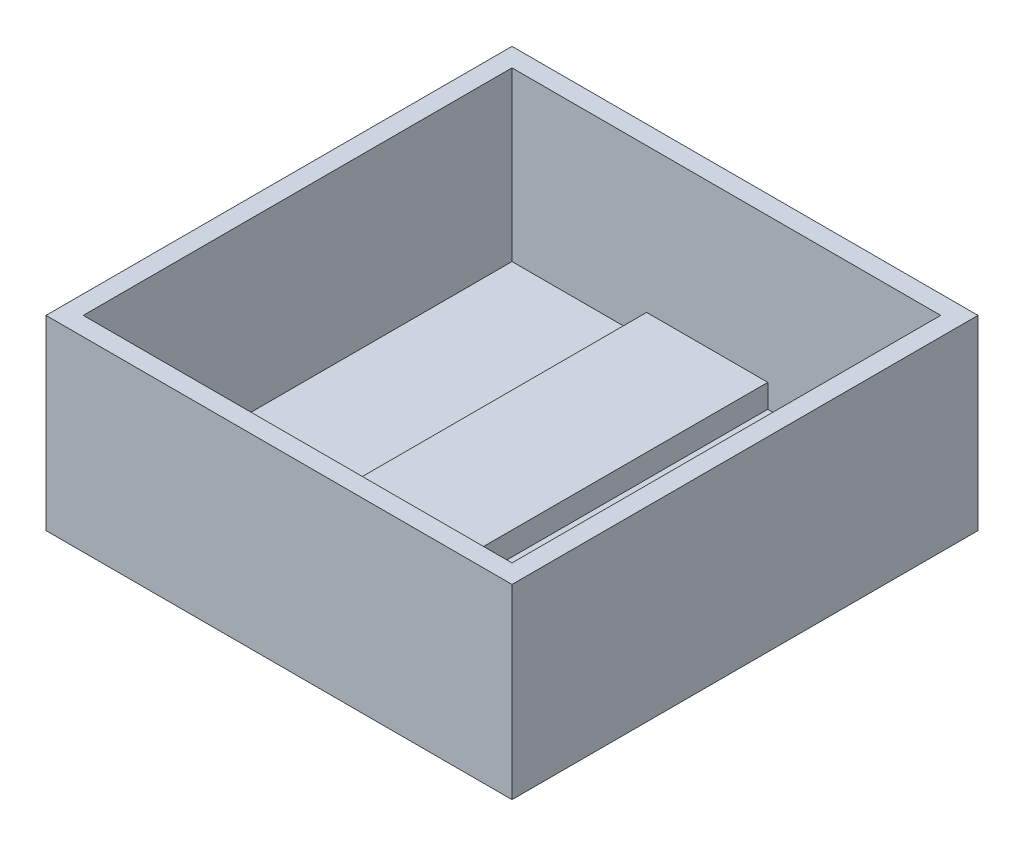
ISO-10303-21;
HEADER;
FILE_DESCRIPTION(('STEP AP214'),'2;1');
FILE_NAME('part.step','',(''),(''),'','','');
FILE_SCHEMA(('AUTOMOTIVE_DESIGN { 1 0 10303 214 1 1 1 1 }'));
ENDSEC;
DATA;
#1=APPLICATION_CONTEXT('core data for automotive mechanical design processes');
#2=APPLICATION_PROTOCOL_DEFINITION('international standard','automotive_design',2000,#1);
#3=PRODUCT_CONTEXT('',#1,'mechanical');
#4=PRODUCT('Part','Part','',(#3));
#5=PRODUCT_RELATED_PRODUCT_CATEGORY('part','',(#4));
#6=PRODUCT_DEFINITION_FORMATION('','',#4);
#7=PRODUCT_DEFINITION_CONTEXT('part definition',#1,'design');
#8=PRODUCT_DEFINITION('design','',#6,#7);
#9=PRODUCT_DEFINITION_SHAPE('','',#8);
#10=(LENGTH_UNIT() NAMED_UNIT(*) SI_UNIT(.MILLI.,.METRE.));
#11=(NAMED_UNIT(*) PLANE_ANGLE_UNIT() SI_UNIT($,.RADIAN.));
#12=(NAMED_UNIT(*) SI_UNIT($,.STERADIAN.) SOLID_ANGLE_UNIT());
#13=UNCERTAINTY_MEASURE_WITH_UNIT(LENGTH_MEASURE(1.E-05),#10,'distance_accuracy_value','');
#14=(GEOMETRIC_REPRESENTATION_CONTEXT(3) GLOBAL_UNCERTAINTY_ASSIGNED_CONTEXT((#13)) GLOBAL_UNIT_ASSIGNED_CONTEXT((#10,
#11,#12)) REPRESENTATION_CONTEXT('',''));
#15=CARTESIAN_POINT('',(0.,0.,0.));
#16=DIRECTION('',(0.,0.,1.));
#17=DIRECTION('',(1.,0.,0.));
#18=AXIS2_PLACEMENT_3D('',#15,#16,#17);
#19=CARTESIAN_POINT('',(-46.5712229422652,4.,-56.0826927806848));
#20=DIRECTION('',(0.,0.,-1.));
#21=DIRECTION('',(-1.,0.,0.));
#22=AXIS2_PLACEMENT_3D('',#19,#20,#21);
#23=PLANE('',#22);
#24=DIRECTION('',(0.,-1.,0.));
#25=VECTOR('',#24,1.);
#26=CARTESIAN_POINT('',(-17.678043983412,4.,-56.0826927806848));
#27=LINE('',#26,#25);
#28=CARTESIAN_POINT('',(-17.678043983412,9.00000000000001,-56.0826927806848));
#29=VERTEX_POINT('',#28);
#30=CARTESIAN_POINT('',(-17.678043983412,4.,-56.0826927806848));
#31=VERTEX_POINT('',#30);
#32=EDGE_CURVE('E147',#29,#31,#27,.T.);
#33=ORIENTED_EDGE('',*,*,#32,.F.);
#34=DIRECTION('',(1.,0.,0.));
#35=VECTOR('',#34,1.);
#36=CARTESIAN_POINT('',(-46.5712229422652,9.00000000000001,-56.0826927806848));
#37=LINE('',#36,#35);
#38=CARTESIAN_POINT('',(8.32195601658795,9.00000000000001,-56.0826927806848));
#39=VERTEX_POINT('',#38);
#40=EDGE_CURVE('E11',#29,#39,#37,.T.);
#41=ORIENTED_EDGE('',*,*,#40,.T.);
#42=DIRECTION('',(0.,1.,0.));
#43=VECTOR('',#42,1.);
#44=CARTESIAN_POINT('',(8.32195601658795,4.,-56.0826927806848));
#45=LINE('',#44,#43);
#46=CARTESIAN_POINT('',(8.32195601658795,4.,-56.0826927806848));
#47=VERTEX_POINT('',#46);
#48=EDGE_CURVE('E145',#47,#39,#45,.T.);
#49=ORIENTED_EDGE('',*,*,#48,.F.);
#50=DIRECTION('',(-1.,0.,0.));
#51=VECTOR('',#50,1.);
#52=CARTESIAN_POINT('',(-46.5712229422652,4.,-56.0826927806848));
#53=LINE('',#52,#51);
#54=CARTESIAN_POINT('',(45.4287770577348,4.,-56.0826927806848));
#55=VERTEX_POINT('',#54);
#56=EDGE_CURVE('E164',#55,#47,#53,.T.);
#57=ORIENTED_EDGE('',*,*,#56,.F.);
#58=DIRECTION('',(0.,1.,0.));
#59=VECTOR('',#58,1.);
#60=CARTESIAN_POINT('',(45.4287770577348,4.,-56.0826927806848));
#61=LINE('',#60,#59);
#62=CARTESIAN_POINT('',(45.4287770577348,40.,-56.0826927806848));
#63=VERTEX_POINT('',#62);
#64=EDGE_CURVE('E180',#55,#63,#61,.T.);
#65=ORIENTED_EDGE('',*,*,#64,.T.);
#66=DIRECTION('',(-1.,0.,0.));
#67=VECTOR('',#66,1.);
#68=CARTESIAN_POINT('',(-46.5712229422652,40.,-56.0826927806848));
#69=LINE('',#68,#67);
#70=CARTESIAN_POINT('',(-46.5712229422652,40.,-56.0826927806848));
#71=VERTEX_POINT('',#70);
#72=EDGE_CURVE('E157',#63,#71,#69,.T.);
#73=ORIENTED_EDGE('',*,*,#72,.T.);
#74=DIRECTION('',(0.,1.,0.));
#75=VECTOR('',#74,1.);
#76=CARTESIAN_POINT('',(-46.5712229422652,4.,-56.0826927806848));
#77=LINE('',#76,#75);
#78=CARTESIAN_POINT('',(-46.5712229422652,4.,-56.0826927806848));
#79=VERTEX_POINT('',#78);
#80=EDGE_CURVE('E177',#79,#71,#77,.T.);
#81=ORIENTED_EDGE('',*,*,#80,.F.);
#82=EDGE_CURVE('E163',#31,#79,#53,.T.);
#83=ORIENTED_EDGE('',*,*,#82,.F.);
#84=EDGE_LOOP('',(#33,#41,#49,#57,#65,#73,#81,#83));
#85=FACE_BOUND('',#84,.T.);
#86=ADVANCED_FACE('F37',(#85),#23,.F.);
#87=CARTESIAN_POINT('',(0.,4.,0.));
#88=DIRECTION('',(0.,1.,0.));
#89=DIRECTION('',(0.,0.,1.));
#90=AXIS2_PLACEMENT_3D('',#87,#88,#89);
#91=PLANE('',#90);
#92=DIRECTION('',(1.,0.,0.));
#93=VECTOR('',#92,1.);
#94=CARTESIAN_POINT('',(-17.678043983412,4.,9.91730721931521));
#95=LINE('',#94,#93);
#96=CARTESIAN_POINT('',(-17.678043983412,4.,9.91730721931521));
#97=VERTEX_POINT('',#96);
#98=CARTESIAN_POINT('',(8.32195601658795,4.,9.91730721931521));
#99=VERTEX_POINT('',#98);
#100=EDGE_CURVE('E218',#97,#99,#95,.T.);
#101=ORIENTED_EDGE('',*,*,#100,.F.);
#102=DIRECTION('',(0.,0.,-1.));
#103=VECTOR('',#102,1.);
#104=CARTESIAN_POINT('',(-17.678043983412,4.,0.));
#105=LINE('',#104,#103);
#106=EDGE_CURVE('E45',#97,#31,#105,.T.);
#107=ORIENTED_EDGE('',*,*,#106,.T.);
#108=ORIENTED_EDGE('',*,*,#82,.T.);
#109=DIRECTION('',(0.,0.,1.));
#110=VECTOR('',#109,1.);
#111=CARTESIAN_POINT('',(-46.5712229422652,4.,-56.0826927806848));
#112=LINE('',#111,#110);
#113=CARTESIAN_POINT('',(-46.5712229422652,4.,35.9173072193152));
#114=VERTEX_POINT('',#113);
#115=EDGE_CURVE('E153',#79,#114,#112,.T.);
#116=ORIENTED_EDGE('',*,*,#115,.T.);
#117=DIRECTION('',(1.,0.,0.));
#118=VECTOR('',#117,1.);
#119=CARTESIAN_POINT('',(-46.5712229422652,4.,35.9173072193152));
#120=LINE('',#119,#118);
#121=CARTESIAN_POINT('',(45.4287770577348,4.,35.9173072193152));
#122=VERTEX_POINT('',#121);
#123=EDGE_CURVE('E156',#114,#122,#120,.T.);
#124=ORIENTED_EDGE('',*,*,#123,.T.);
#125=DIRECTION('',(0.,0.,-1.));
#126=VECTOR('',#125,1.);
#127=CARTESIAN_POINT('',(45.4287770577348,4.,-56.0826927806848));
#128=LINE('',#127,#126);
#129=EDGE_CURVE('E160',#122,#55,#128,.T.);
#130=ORIENTED_EDGE('',*,*,#129,.T.);
#131=ORIENTED_EDGE('',*,*,#56,.T.);
#132=DIRECTION('',(0.,0.,-1.));
#133=VECTOR('',#132,1.);
#134=CARTESIAN_POINT('',(8.32195601658795,4.,-60.0826927806848));
#135=LINE('',#134,#133);
#136=EDGE_CURVE('E134',#99,#47,#135,.T.);
#137=ORIENTED_EDGE('',*,*,#136,.F.);
#138=EDGE_LOOP('',(#101,#107,#108,#116,#124,#130,#131,#137));
#139=FACE_BOUND('',#138,.T.);
#140=ADVANCED_FACE('F215',(#139),#91,.T.);
#141=CARTESIAN_POINT('',(-50.5712229422652,40.,39.9173072193152));
#142=DIRECTION('',(1.,0.,0.));
#143=DIRECTION('',(0.,0.,-1.));
#144=AXIS2_PLACEMENT_3D('',#141,#142,#143);
#145=PLANE('',#144);
#146=DIRECTION('',(0.,0.,1.));
#147=VECTOR('',#146,1.);
#148=CARTESIAN_POINT('',(-50.5712229422652,0.,39.9173072193152));
#149=LINE('',#148,#147);
#150=CARTESIAN_POINT('',(-50.5712229422652,0.,-60.0826927806848));
#151=VERTEX_POINT('',#150);
#152=CARTESIAN_POINT('',(-50.5712229422652,0.,39.9173072193152));
#153=VERTEX_POINT('',#152);
#154=EDGE_CURVE('E179',#151,#153,#149,.T.);
#155=ORIENTED_EDGE('',*,*,#154,.T.);
#156=DIRECTION('',(0.,-1.,0.));
#157=VECTOR('',#156,1.);
#158=CARTESIAN_POINT('',(-50.5712229422652,40.,39.9173072193152));
#159=LINE('',#158,#157);
#160=CARTESIAN_POINT('',(-50.5712229422652,40.,39.9173072193152));
#161=VERTEX_POINT('',#160);
#162=EDGE_CURVE('E211',#161,#153,#159,.T.);
#163=ORIENTED_EDGE('',*,*,#162,.F.);
#164=DIRECTION('',(0.,0.,1.));
#165=VECTOR('',#164,1.);
#166=CARTESIAN_POINT('',(-50.5712229422652,40.,39.9173072193152));
#167=LINE('',#166,#165);
#168=CARTESIAN_POINT('',(-50.5712229422652,40.,-60.0826927806848));
#169=VERTEX_POINT('',#168);
#170=EDGE_CURVE('E185',#169,#161,#167,.T.);
#171=ORIENTED_EDGE('',*,*,#170,.F.);
#172=DIRECTION('',(0.,-1.,0.));
#173=VECTOR('',#172,1.);
#174=CARTESIAN_POINT('',(-50.5712229422652,40.,-60.0826927806848));
#175=LINE('',#174,#173);
#176=EDGE_CURVE('E195',#169,#151,#175,.T.);
#177=ORIENTED_EDGE('',*,*,#176,.T.);
#178=EDGE_LOOP('',(#155,#163,#171,#177));
#179=FACE_BOUND('',#178,.T.);
#180=ADVANCED_FACE('F39',(#179),#145,.F.);
#181=CARTESIAN_POINT('',(-50.5712229422652,40.,39.9173072193152));
#182=DIRECTION('',(0.,0.,-1.));
#183=DIRECTION('',(-1.,0.,0.));
#184=AXIS2_PLACEMENT_3D('',#181,#182,#183);
#185=PLANE('',#184);
#186=DIRECTION('',(1.,0.,0.));
#187=VECTOR('',#186,1.);
#188=CARTESIAN_POINT('',(-50.5712229422652,0.,39.9173072193152));
#189=LINE('',#188,#187);
#190=CARTESIAN_POINT('',(49.4287770577348,0.,39.9173072193152));
#191=VERTEX_POINT('',#190);
#192=EDGE_CURVE('E198',#153,#191,#189,.T.);
#193=ORIENTED_EDGE('',*,*,#192,.T.);
#194=DIRECTION('',(0.,-1.,0.));
#195=VECTOR('',#194,1.);
#196=CARTESIAN_POINT('',(49.4287770577348,40.,39.9173072193152));
#197=LINE('',#196,#195);
#198=CARTESIAN_POINT('',(49.4287770577348,40.,39.9173072193152));
#199=VERTEX_POINT('',#198);
#200=EDGE_CURVE('E208',#199,#191,#197,.T.);
#201=ORIENTED_EDGE('',*,*,#200,.F.);
#202=DIRECTION('',(1.,0.,0.));
#203=VECTOR('',#202,1.);
#204=CARTESIAN_POINT('',(-50.5712229422652,40.,39.9173072193152));
#205=LINE('',#204,#203);
#206=EDGE_CURVE('E188',#161,#199,#205,.T.);
#207=ORIENTED_EDGE('',*,*,#206,.F.);
#208=ORIENTED_EDGE('',*,*,#162,.T.);
#209=EDGE_LOOP('',(#193,#201,#207,#208));
#210=FACE_BOUND('',#209,.T.);
#211=ADVANCED_FACE('F272',(#210),#185,.F.);
#212=CARTESIAN_POINT('',(49.4287770577348,40.,39.9173072193152));
#213=DIRECTION('',(-1.,0.,0.));
#214=DIRECTION('',(0.,0.,1.));
#215=AXIS2_PLACEMENT_3D('',#212,#213,#214);
#216=PLANE('',#215);
#217=DIRECTION('',(0.,0.,-1.));
#218=VECTOR('',#217,1.);
#219=CARTESIAN_POINT('',(49.4287770577348,0.,39.9173072193152));
#220=LINE('',#219,#218);
#221=CARTESIAN_POINT('',(49.4287770577348,0.,-60.0826927806848));
#222=VERTEX_POINT('',#221);
#223=EDGE_CURVE('E200',#191,#222,#220,.T.);
#224=ORIENTED_EDGE('',*,*,#223,.T.);
#225=DIRECTION('',(0.,-1.,0.));
#226=VECTOR('',#225,1.);
#227=CARTESIAN_POINT('',(49.4287770577348,40.,-60.0826927806848));
#228=LINE('',#227,#226);
#229=CARTESIAN_POINT('',(49.4287770577348,40.,-60.0826927806848));
#230=VERTEX_POINT('',#229);
#231=EDGE_CURVE('E205',#230,#222,#228,.T.);
#232=ORIENTED_EDGE('',*,*,#231,.F.);
#233=DIRECTION('',(0.,0.,-1.));
#234=VECTOR('',#233,1.);
#235=CARTESIAN_POINT('',(49.4287770577348,40.,39.9173072193152));
#236=LINE('',#235,#234);
#237=EDGE_CURVE('E191',#199,#230,#236,.T.);
#238=ORIENTED_EDGE('',*,*,#237,.F.);
#239=ORIENTED_EDGE('',*,*,#200,.T.);
#240=EDGE_LOOP('',(#224,#232,#238,#239));
#241=FACE_BOUND('',#240,.T.);
#242=ADVANCED_FACE('F269',(#241),#216,.F.);
#243=CARTESIAN_POINT('',(-50.5712229422652,40.,-60.0826927806848));
#244=DIRECTION('',(0.,0.,1.));
#245=DIRECTION('',(1.,0.,0.));
#246=AXIS2_PLACEMENT_3D('',#243,#244,#245);
#247=PLANE('',#246);
#248=DIRECTION('',(-1.,0.,0.));
#249=VECTOR('',#248,1.);
#250=CARTESIAN_POINT('',(-50.5712229422652,0.,-60.0826927806848));
#251=LINE('',#250,#249);
#252=EDGE_CURVE('E189',#222,#151,#251,.T.);
#253=ORIENTED_EDGE('',*,*,#252,.T.);
#254=ORIENTED_EDGE('',*,*,#176,.F.);
#255=DIRECTION('',(-1.,0.,0.));
#256=VECTOR('',#255,1.);
#257=CARTESIAN_POINT('',(-50.5712229422652,40.,-60.0826927806848));
#258=LINE('',#257,#256);
#259=EDGE_CURVE('E193',#230,#169,#258,.T.);
#260=ORIENTED_EDGE('',*,*,#259,.F.);
#261=ORIENTED_EDGE('',*,*,#231,.T.);
#262=EDGE_LOOP('',(#253,#254,#260,#261));
#263=FACE_BOUND('',#262,.T.);
#264=ADVANCED_FACE('F262',(#263),#247,.F.);
#265=CARTESIAN_POINT('',(0.,40.,0.));
#266=DIRECTION('',(0.,-1.,0.));
#267=DIRECTION('',(0.,0.,-1.));
#268=AXIS2_PLACEMENT_3D('',#265,#266,#267);
#269=PLANE('',#268);
#270=DIRECTION('',(1.,0.,0.));
#271=VECTOR('',#270,1.);
#272=CARTESIAN_POINT('',(-46.5712229422652,40.,35.9173072193152));
#273=LINE('',#272,#271);
#274=CARTESIAN_POINT('',(-46.5712229422652,40.,35.9173072193152));
#275=VERTEX_POINT('',#274);
#276=CARTESIAN_POINT('',(45.4287770577348,40.,35.9173072193152));
#277=VERTEX_POINT('',#276);
#278=EDGE_CURVE('E169',#275,#277,#273,.T.);
#279=ORIENTED_EDGE('',*,*,#278,.F.);
#280=DIRECTION('',(0.,0.,1.));
#281=VECTOR('',#280,1.);
#282=CARTESIAN_POINT('',(-46.5712229422652,40.,-56.0826927806848));
#283=LINE('',#282,#281);
#284=EDGE_CURVE('E60',#71,#275,#283,.T.);
#285=ORIENTED_EDGE('',*,*,#284,.F.);
#286=ORIENTED_EDGE('',*,*,#72,.F.);
#287=DIRECTION('',(0.,0.,-1.));
#288=VECTOR('',#287,1.);
#289=CARTESIAN_POINT('',(45.4287770577348,40.,-56.0826927806848));
#290=LINE('',#289,#288);
#291=EDGE_CURVE('E172',#277,#63,#290,.T.);
#292=ORIENTED_EDGE('',*,*,#291,.F.);
#293=EDGE_LOOP('',(#279,#285,#286,#292));
#294=FACE_BOUND('',#293,.T.);
#295=ORIENTED_EDGE('',*,*,#170,.T.);
#296=ORIENTED_EDGE('',*,*,#206,.T.);
#297=ORIENTED_EDGE('',*,*,#237,.T.);
#298=ORIENTED_EDGE('',*,*,#259,.T.);
#299=EDGE_LOOP('',(#295,#296,#297,#298));
#300=FACE_BOUND('',#299,.T.);
#301=ADVANCED_FACE('F259',(#294,#300),#269,.F.);
#302=CARTESIAN_POINT('',(0.,0.,0.));
#303=DIRECTION('',(0.,-1.,0.));
#304=DIRECTION('',(0.,0.,-1.));
#305=AXIS2_PLACEMENT_3D('',#302,#303,#304);
#306=PLANE('',#305);
#307=ORIENTED_EDGE('',*,*,#154,.F.);
#308=ORIENTED_EDGE('',*,*,#252,.F.);
#309=ORIENTED_EDGE('',*,*,#223,.F.);
#310=ORIENTED_EDGE('',*,*,#192,.F.);
#311=EDGE_LOOP('',(#307,#308,#309,#310));
#312=FACE_BOUND('',#311,.T.);
#313=ADVANCED_FACE('F258',(#312),#306,.T.);
#314=CARTESIAN_POINT('',(-46.5712229422652,4.,-56.0826927806848));
#315=DIRECTION('',(-1.,0.,0.));
#316=DIRECTION('',(0.,0.,1.));
#317=AXIS2_PLACEMENT_3D('',#314,#315,#316);
#318=PLANE('',#317);
#319=ORIENTED_EDGE('',*,*,#284,.T.);
#320=DIRECTION('',(0.,1.,0.));
#321=VECTOR('',#320,1.);
#322=CARTESIAN_POINT('',(-46.5712229422652,4.,35.9173072193152));
#323=LINE('',#322,#321);
#324=EDGE_CURVE('E167',#114,#275,#323,.T.);
#325=ORIENTED_EDGE('',*,*,#324,.F.);
#326=ORIENTED_EDGE('',*,*,#115,.F.);
#327=ORIENTED_EDGE('',*,*,#80,.T.);
#328=EDGE_LOOP('',(#319,#325,#326,#327));
#329=FACE_BOUND('',#328,.T.);
#330=ADVANCED_FACE('F222',(#329),#318,.F.);
#331=CARTESIAN_POINT('',(45.4287770577348,4.,-56.0826927806848));
#332=DIRECTION('',(1.,0.,0.));
#333=DIRECTION('',(0.,0.,-1.));
#334=AXIS2_PLACEMENT_3D('',#331,#332,#333);
#335=PLANE('',#334);
#336=ORIENTED_EDGE('',*,*,#291,.T.);
#337=ORIENTED_EDGE('',*,*,#64,.F.);
#338=ORIENTED_EDGE('',*,*,#129,.F.);
#339=DIRECTION('',(0.,1.,0.));
#340=VECTOR('',#339,1.);
#341=CARTESIAN_POINT('',(45.4287770577348,4.,35.9173072193152));
#342=LINE('',#341,#340);
#343=EDGE_CURVE('E182',#122,#277,#342,.T.);
#344=ORIENTED_EDGE('',*,*,#343,.T.);
#345=EDGE_LOOP('',(#336,#337,#338,#344));
#346=FACE_BOUND('',#345,.T.);
#347=ADVANCED_FACE('F231',(#346),#335,.F.);
#348=CARTESIAN_POINT('',(-46.5712229422652,4.,35.9173072193152));
#349=DIRECTION('',(0.,0.,1.));
#350=DIRECTION('',(1.,0.,0.));
#351=AXIS2_PLACEMENT_3D('',#348,#349,#350);
#352=PLANE('',#351);
#353=ORIENTED_EDGE('',*,*,#278,.T.);
#354=ORIENTED_EDGE('',*,*,#343,.F.);
#355=ORIENTED_EDGE('',*,*,#123,.F.);
#356=ORIENTED_EDGE('',*,*,#324,.T.);
#357=EDGE_LOOP('',(#353,#354,#355,#356));
#358=FACE_BOUND('',#357,.T.);
#359=ADVANCED_FACE('F227',(#358),#352,.F.);
#360=CARTESIAN_POINT('',(0.,9.00000000000001,0.));
#361=DIRECTION('',(0.,1.,0.));
#362=DIRECTION('',(0.,0.,1.));
#363=AXIS2_PLACEMENT_3D('',#360,#361,#362);
#364=PLANE('',#363);
#365=ORIENTED_EDGE('',*,*,#40,.F.);
#366=DIRECTION('',(0.,0.,1.));
#367=VECTOR('',#366,1.);
#368=CARTESIAN_POINT('',(-17.678043983412,9.00000000000001,-60.0826927806848));
#369=LINE('',#368,#367);
#370=CARTESIAN_POINT('',(-17.678043983412,9.00000000000001,9.91730721931521));
#371=VERTEX_POINT('',#370);
#372=EDGE_CURVE('E126',#29,#371,#369,.T.);
#373=ORIENTED_EDGE('',*,*,#372,.T.);
#374=DIRECTION('',(1.,0.,0.));
#375=VECTOR('',#374,1.);
#376=CARTESIAN_POINT('',(-17.678043983412,9.00000000000001,9.91730721931521));
#377=LINE('',#376,#375);
#378=CARTESIAN_POINT('',(8.32195601658795,9.00000000000001,9.91730721931521));
#379=VERTEX_POINT('',#378);
#380=EDGE_CURVE('E130',#371,#379,#377,.T.);
#381=ORIENTED_EDGE('',*,*,#380,.T.);
#382=DIRECTION('',(0.,0.,-1.));
#383=VECTOR('',#382,1.);
#384=CARTESIAN_POINT('',(8.32195601658795,9.00000000000001,-60.0826927806848));
#385=LINE('',#384,#383);
#386=EDGE_CURVE('E141',#379,#39,#385,.T.);
#387=ORIENTED_EDGE('',*,*,#386,.T.);
#388=EDGE_LOOP('',(#365,#373,#381,#387));
#389=FACE_BOUND('',#388,.T.);
#390=ADVANCED_FACE('F128',(#389),#364,.T.);
#391=CARTESIAN_POINT('',(-17.678043983412,9.00000000000001,-60.0826927806848));
#392=DIRECTION('',(1.,0.,0.));
#393=DIRECTION('',(0.,0.,-1.));
#394=AXIS2_PLACEMENT_3D('',#391,#392,#393);
#395=PLANE('',#394);
#396=ORIENTED_EDGE('',*,*,#372,.F.);
#397=ORIENTED_EDGE('',*,*,#32,.T.);
#398=ORIENTED_EDGE('',*,*,#106,.F.);
#399=DIRECTION('',(0.,-1.,0.));
#400=VECTOR('',#399,1.);
#401=CARTESIAN_POINT('',(-17.678043983412,9.00000000000001,9.91730721931521));
#402=LINE('',#401,#400);
#403=EDGE_CURVE('E139',#371,#97,#402,.T.);
#404=ORIENTED_EDGE('',*,*,#403,.F.);
#405=EDGE_LOOP('',(#396,#397,#398,#404));
#406=FACE_BOUND('',#405,.T.);
#407=ADVANCED_FACE('F143',(#406),#395,.F.);
#408=CARTESIAN_POINT('',(8.32195601658795,9.00000000000001,-60.0826927806848));
#409=DIRECTION('',(-1.,0.,0.));
#410=DIRECTION('',(0.,0.,1.));
#411=AXIS2_PLACEMENT_3D('',#408,#409,#410);
#412=PLANE('',#411);
#413=ORIENTED_EDGE('',*,*,#136,.T.);
#414=ORIENTED_EDGE('',*,*,#48,.T.);
#415=ORIENTED_EDGE('',*,*,#386,.F.);
#416=DIRECTION('',(0.,-1.,0.));
#417=VECTOR('',#416,1.);
#418=CARTESIAN_POINT('',(8.32195601658795,9.00000000000001,9.91730721931521));
#419=LINE('',#418,#417);
#420=EDGE_CURVE('E52',#379,#99,#419,.T.);
#421=ORIENTED_EDGE('',*,*,#420,.T.);
#422=EDGE_LOOP('',(#413,#414,#415,#421));
#423=FACE_BOUND('',#422,.T.);
#424=ADVANCED_FACE('F235',(#423),#412,.F.);
#425=CARTESIAN_POINT('',(-17.678043983412,9.00000000000001,9.91730721931521));
#426=DIRECTION('',(0.,0.,-1.));
#427=DIRECTION('',(-1.,0.,0.));
#428=AXIS2_PLACEMENT_3D('',#425,#426,#427);
#429=PLANE('',#428);
#430=ORIENTED_EDGE('',*,*,#100,.T.);
#431=ORIENTED_EDGE('',*,*,#420,.F.);
#432=ORIENTED_EDGE('',*,*,#380,.F.);
#433=ORIENTED_EDGE('',*,*,#403,.T.);
#434=EDGE_LOOP('',(#430,#431,#432,#433));
#435=FACE_BOUND('',#434,.T.);
#436=ADVANCED_FACE('F138',(#435),#429,.F.);
#437=CLOSED_SHELL('',(#86,#140,#180,#211,#242,#264,#301,#313,#330,#347,#359,#390,#407,#424,#436));
#438=MANIFOLD_SOLID_BREP('B2',#437);
#439=ADVANCED_BREP_SHAPE_REPRESENTATION('',(#18,#438),#14);
#440=SHAPE_DEFINITION_REPRESENTATION(#9,#439);
ENDSEC;
END-ISO-10303-21;
